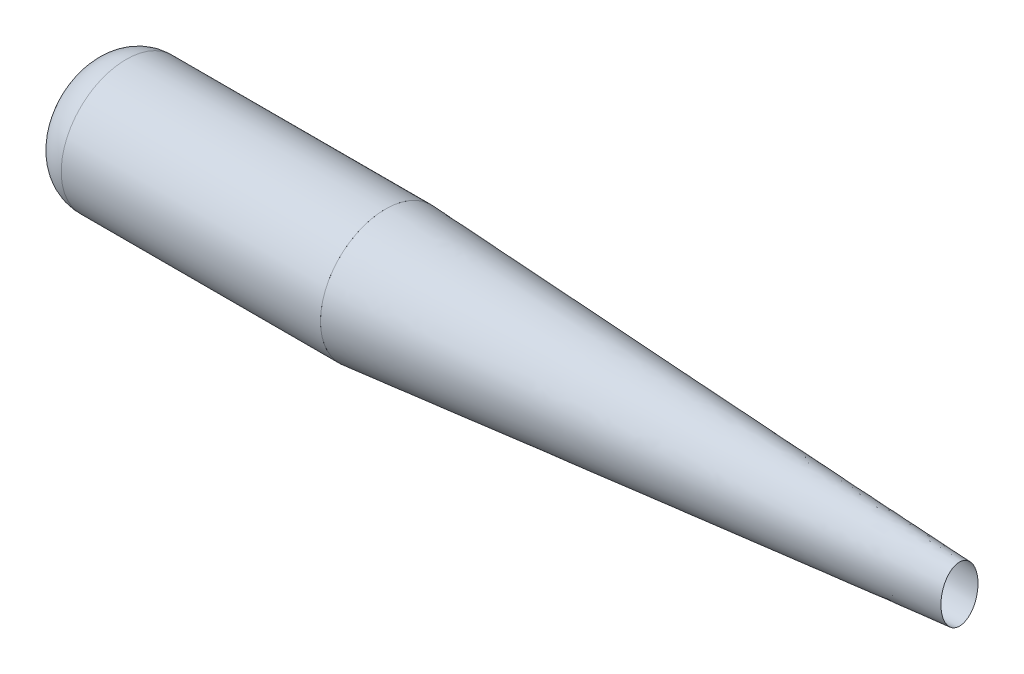
ISO-10303-21;
HEADER;
FILE_DESCRIPTION(('STEP AP214'),'2;1');
FILE_NAME('part.step','',(''),(''),'','','');
FILE_SCHEMA(('AUTOMOTIVE_DESIGN { 1 0 10303 214 1 1 1 1 }'));
ENDSEC;
DATA;
#1=APPLICATION_CONTEXT('core data for automotive mechanical design processes');
#2=APPLICATION_PROTOCOL_DEFINITION('international standard','automotive_design',2000,#1);
#3=PRODUCT_CONTEXT('',#1,'mechanical');
#4=PRODUCT('Part','Part','',(#3));
#5=PRODUCT_RELATED_PRODUCT_CATEGORY('part','',(#4));
#6=PRODUCT_DEFINITION_FORMATION('','',#4);
#7=PRODUCT_DEFINITION_CONTEXT('part definition',#1,'design');
#8=PRODUCT_DEFINITION('design','',#6,#7);
#9=PRODUCT_DEFINITION_SHAPE('','',#8);
#10=(LENGTH_UNIT() NAMED_UNIT(*) SI_UNIT(.MILLI.,.METRE.));
#11=(NAMED_UNIT(*) PLANE_ANGLE_UNIT() SI_UNIT($,.RADIAN.));
#12=(NAMED_UNIT(*) SI_UNIT($,.STERADIAN.) SOLID_ANGLE_UNIT());
#13=UNCERTAINTY_MEASURE_WITH_UNIT(LENGTH_MEASURE(1.E-05),#10,'distance_accuracy_value','');
#14=(GEOMETRIC_REPRESENTATION_CONTEXT(3) GLOBAL_UNCERTAINTY_ASSIGNED_CONTEXT((#13)) GLOBAL_UNIT_ASSIGNED_CONTEXT((#10,
#11,#12)) REPRESENTATION_CONTEXT('',''));
#15=CARTESIAN_POINT('',(0.,0.,0.));
#16=DIRECTION('',(0.,0.,1.));
#17=DIRECTION('',(1.,0.,0.));
#18=AXIS2_PLACEMENT_3D('',#15,#16,#17);
#19=CARTESIAN_POINT('',(160.,0.,-35.));
#20=CARTESIAN_POINT('',(263.333333333333,3.33333333333333,-26.6666666666667));
#21=CARTESIAN_POINT('',(366.666666666667,6.66666666666666,-18.3333333333333));
#22=CARTESIAN_POINT('',(470.,10.,-10.));
#23=CARTESIAN_POINT('',(160.,2.2907446249626,-35.));
#24=CARTESIAN_POINT('',(263.333333333333,5.13593806917554,-26.6666666666667));
#25=CARTESIAN_POINT('',(366.666666666667,7.98113151338849,-18.3333333333333));
#26=CARTESIAN_POINT('',(470.,10.8263249576014,-10.));
#27=CARTESIAN_POINT('',(160.,6.87217397037005,-34.5489011907527));
#28=CARTESIAN_POINT('',(263.333333333333,8.74111426669822,-26.3356648520266));
#29=CARTESIAN_POINT('',(366.666666666667,10.6100545630264,-18.1224285133004));
#30=CARTESIAN_POINT('',(470.,12.4789948593546,-9.90919217457428));
#31=CARTESIAN_POINT('',(160.,13.4802960863983,-32.5442620372788));
#32=CARTESIAN_POINT('',(263.333333333334,13.9626756302988,-24.8615380126565));
#33=CARTESIAN_POINT('',(366.666666666667,14.4450551741992,-17.1788139880343));
#34=CARTESIAN_POINT('',(470.,14.9274347180997,-9.49608996341209));
#35=CARTESIAN_POINT('',(160.,19.5703557965586,-29.2891017108546));
#36=CARTESIAN_POINT('',(263.333333333333,18.8167461273719,-22.4567418642144));
#37=CARTESIAN_POINT('',(366.666666666666,18.0631364581851,-15.6243820175742));
#38=CARTESIAN_POINT('',(470.,17.3095267889983,-8.79202217093392));
#39=CARTESIAN_POINT('',(160.,24.9083452853691,-24.9082788510293));
#40=CARTESIAN_POINT('',(263.333333333333,23.1309813977877,-19.1963711667751));
#41=CARTESIAN_POINT('',(366.666666666667,21.3536175102062,-13.484463482521));
#42=CARTESIAN_POINT('',(470.,19.5762536226248,-7.7725557982668));
#43=CARTESIAN_POINT('',(160.,29.2891044173845,-19.570338475145));
#44=CARTESIAN_POINT('',(263.333333333333,26.744136013561,-15.1812036963901));
#45=CARTESIAN_POINT('',(366.666666666667,24.1991676097375,-10.7920689176353));
#46=CARTESIAN_POINT('',(470.,21.654199205914,-6.40293413888038));
#47=CARTESIAN_POINT('',(160.,32.5442975900147,-13.4802693135727));
#48=CARTESIAN_POINT('',(263.333333333333,29.5035965677605,-10.5345265102586));
#49=CARTESIAN_POINT('',(366.666666666666,26.4628955455064,-7.58878370694443));
#50=CARTESIAN_POINT('',(469.999999999999,23.4221945232523,-4.64304090363027));
#51=CARTESIAN_POINT('',(160.,34.5488400594126,-6.87218748700974));
#52=CARTESIAN_POINT('',(263.333333333334,31.2603620625595,-5.4071170467015));
#53=CARTESIAN_POINT('',(366.666666666667,27.9718840657064,-3.94204660639326));
#54=CARTESIAN_POINT('',(470.,24.6834060688532,-2.47697616608501));
#55=CARTESIAN_POINT('',(160.,35.225689068238,0.));
#56=CARTESIAN_POINT('',(263.333333333333,31.8702303801478,0.));
#57=CARTESIAN_POINT('',(366.666666666666,28.5147716920577,0.));
#58=CARTESIAN_POINT('',(470.,25.1593130039676,0.));
#59=CARTESIAN_POINT('',(160.,34.5488400594126,6.8721874870098));
#60=CARTESIAN_POINT('',(263.333333333333,31.2603620625595,5.40711704670152));
#61=CARTESIAN_POINT('',(366.666666666667,27.9718840657064,3.94204660639325));
#62=CARTESIAN_POINT('',(470.,24.6834060688532,2.47697616608497));
#63=CARTESIAN_POINT('',(160.,32.5442975900147,13.4802693135728));
#64=CARTESIAN_POINT('',(263.333333333334,29.5035965677606,10.5345265102586));
#65=CARTESIAN_POINT('',(366.666666666667,26.4628955455065,7.58878370694443));
#66=CARTESIAN_POINT('',(470.,23.4221945232524,4.64304090363026));
#67=CARTESIAN_POINT('',(160.,29.2891044173845,19.570338475145));
#68=CARTESIAN_POINT('',(263.333333333333,26.744136013561,15.1812036963901));
#69=CARTESIAN_POINT('',(366.666666666666,24.1991676097375,10.7920689176352));
#70=CARTESIAN_POINT('',(469.999999999999,21.654199205914,6.40293413888035));
#71=CARTESIAN_POINT('',(160.000000000001,24.9083452853691,24.9082788510293));
#72=CARTESIAN_POINT('',(263.333333333334,23.1309813977877,19.1963711667751));
#73=CARTESIAN_POINT('',(366.666666666667,21.3536175102062,13.484463482521));
#74=CARTESIAN_POINT('',(470.,19.5762536226248,7.77255579826679));
#75=CARTESIAN_POINT('',(160.,19.5703557965587,29.2891017108547));
#76=CARTESIAN_POINT('',(263.333333333333,18.8167461273719,22.4567418642145));
#77=CARTESIAN_POINT('',(366.666666666666,18.0631364581851,15.6243820175742));
#78=CARTESIAN_POINT('',(469.999999999999,17.3095267889983,8.79202217093389));
#79=CARTESIAN_POINT('',(160.,13.4802960863983,32.5442620372787));
#80=CARTESIAN_POINT('',(263.333333333334,13.9626756302988,24.8615380126565));
#81=CARTESIAN_POINT('',(366.666666666667,14.4450551741992,17.1788139880343));
#82=CARTESIAN_POINT('',(470.,14.9274347180997,9.49608996341211));
#83=CARTESIAN_POINT('',(160.,6.8721739703701,34.5489011907528));
#84=CARTESIAN_POINT('',(263.333333333333,8.74111426669826,26.3356648520266));
#85=CARTESIAN_POINT('',(366.666666666667,10.6100545630264,18.1224285133004));
#86=CARTESIAN_POINT('',(470.,12.4789948593546,9.90919217457426));
#87=CARTESIAN_POINT('',(160.,2.29074462496261,35.));
#88=CARTESIAN_POINT('',(263.333333333333,5.13593806917555,26.6666666666667));
#89=CARTESIAN_POINT('',(366.666666666667,7.98113151338849,18.3333333333333));
#90=CARTESIAN_POINT('',(470.,10.8263249576014,10.));
#91=CARTESIAN_POINT('',(160.,-2.2907446249626,35.));
#92=CARTESIAN_POINT('',(263.333333333333,1.53072859749112,26.6666666666667));
#93=CARTESIAN_POINT('',(366.666666666667,5.35220181994485,18.3333333333333));
#94=CARTESIAN_POINT('',(470.,9.17367504239857,10.));
#95=CARTESIAN_POINT('',(160.,-6.87217397037008,34.5489011907528));
#96=CARTESIAN_POINT('',(263.333333333333,-2.07444760003157,26.3356648520266));
#97=CARTESIAN_POINT('',(366.666666666666,2.72327877030694,18.1224285133004));
#98=CARTESIAN_POINT('',(470.,7.52100514064545,9.90919217457427));
#99=CARTESIAN_POINT('',(160.,-13.4802960863983,32.5442620372787));
#100=CARTESIAN_POINT('',(263.333333333334,-7.29600896363213,24.8615380126565));
#101=CARTESIAN_POINT('',(366.666666666667,-1.11172184086592,17.1788139880343));
#102=CARTESIAN_POINT('',(470.,5.07256528190029,9.49608996341211));
#103=CARTESIAN_POINT('',(160.,-19.5703557965587,29.2891017108548));
#104=CARTESIAN_POINT('',(263.333333333333,-12.1500794607052,22.4567418642145));
#105=CARTESIAN_POINT('',(366.666666666666,-4.72980312485177,15.6243820175742));
#106=CARTESIAN_POINT('',(470.,2.69047321100169,8.79202217093387));
#107=CARTESIAN_POINT('',(160.,-24.9083452853691,24.9082788510292));
#108=CARTESIAN_POINT('',(263.333333333333,-16.464314731121,19.1963711667751));
#109=CARTESIAN_POINT('',(366.666666666666,-8.02028417687292,13.4844634825209));
#110=CARTESIAN_POINT('',(469.999999999999,0.423746377375175,7.77255579826682));
#111=CARTESIAN_POINT('',(160.,-29.2891044173845,19.570338475145));
#112=CARTESIAN_POINT('',(263.333333333334,-20.0774693468943,15.1812036963901));
#113=CARTESIAN_POINT('',(366.666666666667,-10.8658342764042,10.7920689176353));
#114=CARTESIAN_POINT('',(470.,-1.65419920591402,6.40293413888035));
#115=CARTESIAN_POINT('',(160.,-32.5442975900147,13.4802693135726));
#116=CARTESIAN_POINT('',(263.333333333333,-22.8369299010939,10.5345265102585));
#117=CARTESIAN_POINT('',(366.666666666667,-13.1295622121731,7.58878370694439));
#118=CARTESIAN_POINT('',(470.,-3.42219452325231,4.64304090363027));
#119=CARTESIAN_POINT('',(160.,-34.5488400594126,6.87218748700977));
#120=CARTESIAN_POINT('',(263.333333333333,-24.5936953958928,5.40711704670151));
#121=CARTESIAN_POINT('',(366.666666666666,-14.6385507323731,3.94204660639324));
#122=CARTESIAN_POINT('',(469.999999999999,-4.6834060688533,2.47697616608498));
#123=CARTESIAN_POINT('',(160.,-35.2256890682379,0.));
#124=CARTESIAN_POINT('',(263.333333333334,-25.2035637134811,0.));
#125=CARTESIAN_POINT('',(366.666666666667,-15.1814383587244,0.));
#126=CARTESIAN_POINT('',(470.,-5.15931300396757,0.));
#127=CARTESIAN_POINT('',(160.,-34.5488400594126,-6.8721874870098));
#128=CARTESIAN_POINT('',(263.333333333333,-24.5936953958929,-5.40711704670154));
#129=CARTESIAN_POINT('',(366.666666666667,-14.6385507323731,-3.94204660639327));
#130=CARTESIAN_POINT('',(470.,-4.68340606885328,-2.47697616608501));
#131=CARTESIAN_POINT('',(160.,-32.5442975900147,-13.4802693135727));
#132=CARTESIAN_POINT('',(263.333333333333,-22.8369299010939,-10.5345265102586));
#133=CARTESIAN_POINT('',(366.666666666667,-13.1295622121731,-7.58878370694444));
#134=CARTESIAN_POINT('',(470.,-3.42219452325229,-4.6430409036303));
#135=CARTESIAN_POINT('',(160.,-29.2891044173845,-19.570338475145));
#136=CARTESIAN_POINT('',(263.333333333333,-20.0774693468943,-15.1812036963901));
#137=CARTESIAN_POINT('',(366.666666666667,-10.8658342764041,-10.7920689176353));
#138=CARTESIAN_POINT('',(470.,-1.65419920591399,-6.40293413888037));
#139=CARTESIAN_POINT('',(160.,-24.9083452853691,-24.9082788510293));
#140=CARTESIAN_POINT('',(263.333333333334,-16.464314731121,-19.1963711667751));
#141=CARTESIAN_POINT('',(366.666666666667,-8.02028417687289,-13.484463482521));
#142=CARTESIAN_POINT('',(470.,0.423746377375195,-7.77255579826683));
#143=CARTESIAN_POINT('',(160.,-19.5703557965587,-29.2891017108547));
#144=CARTESIAN_POINT('',(263.333333333333,-12.1500794607052,-22.4567418642145));
#145=CARTESIAN_POINT('',(366.666666666666,-4.72980312485176,-15.6243820175742));
#146=CARTESIAN_POINT('',(470.,2.6904732110017,-8.79202217093389));
#147=CARTESIAN_POINT('',(160.,-13.4802960863983,-32.5442620372787));
#148=CARTESIAN_POINT('',(263.333333333333,-7.29600896363209,-24.8615380126565));
#149=CARTESIAN_POINT('',(366.666666666667,-1.11172184086589,-17.1788139880343));
#150=CARTESIAN_POINT('',(470.,5.0725652819003,-9.49608996341211));
#151=CARTESIAN_POINT('',(160.,-6.87217397037005,-34.5489011907528));
#152=CARTESIAN_POINT('',(263.333333333333,-2.07444760003155,-26.3356648520266));
#153=CARTESIAN_POINT('',(366.666666666667,2.72327877030695,-18.1224285133004));
#154=CARTESIAN_POINT('',(470.,7.52100514064546,-9.90919217457426));
#155=CARTESIAN_POINT('',(160.,-2.2907446249626,-35.));
#156=CARTESIAN_POINT('',(263.333333333333,1.53072859749112,-26.6666666666667));
#157=CARTESIAN_POINT('',(366.666666666667,5.35220181994484,-18.3333333333333));
#158=CARTESIAN_POINT('',(470.,9.17367504239856,-10.));
#159=CARTESIAN_POINT('',(160.,0.,-35.));
#160=CARTESIAN_POINT('',(263.333333333333,3.33333333333333,-26.6666666666667));
#161=CARTESIAN_POINT('',(366.666666666667,6.66666666666666,-18.3333333333333));
#162=CARTESIAN_POINT('',(470.,10.,-10.));
#163=B_SPLINE_SURFACE_WITH_KNOTS('',3,3,((#19,#20,#21,#22),(#23,#24,#25,#26),(#27,#28,#29,#30),
(#31,#32,#33,#34),(#35,#36,#37,#38),(#39,#40,#41,#42),(#43,#44,#45,#46),(#47,#48,#49,#50),(#51,
#52,#53,#54),(#55,#56,#57,#58),(#59,#60,#61,#62),(#63,#64,#65,#66),(#67,#68,#69,#70),(#71,#72,
#73,#74),(#75,#76,#77,#78),(#79,#80,#81,#82),(#83,#84,#85,#86),(#87,#88,#89,#90),(#91,#92,#93,
#94),(#95,#96,#97,#98),(#99,#100,#101,#102),(#103,#104,#105,#106),(#107,#108,#109,#110),(#111,
#112,#113,#114),(#115,#116,#117,#118),(#119,#120,#121,#122),(#123,#124,#125,#126),(#127,#128,
#129,#130),(#131,#132,#133,#134),(#135,#136,#137,#138),(#139,#140,#141,#142),(#143,#144,#145,
#146),(#147,#148,#149,#150),(#151,#152,#153,#154),(#155,#156,#157,#158),(#159,#160,#161,#162)),
.UNSPECIFIED.,.T.,.F.,.F.,(4,1,1,1,1,1,1,1,1,1,1,1,1,1,1,1,2,1,1,1,1,1,1,1,1,1,1,1,1,1,1,1,4),
(4,4),(0.,0.03125,0.0625,0.09375,0.125,0.15625,0.1875,0.21875,0.25,0.28125,0.3125,0.34375,0.375,
0.40625,0.4375,0.46875,0.5,0.53125,0.5625,0.59375,0.625,0.65625,0.6875,0.71875,0.75,0.78125,
0.8125,0.84375,0.875,0.90625,0.9375,0.96875,1.),(0.,1.),.UNSPECIFIED.);
#164=CARTESIAN_POINT('',(160.,0.,-35.));
#165=CARTESIAN_POINT('',(160.,2.2907446249626,-35.));
#166=CARTESIAN_POINT('',(160.,6.87217397037005,-34.5489011907527));
#167=CARTESIAN_POINT('',(160.,13.4802960863983,-32.5442620372788));
#168=CARTESIAN_POINT('',(160.,19.5703557965586,-29.2891017108546));
#169=CARTESIAN_POINT('',(160.,24.9083452853691,-24.9082788510293));
#170=CARTESIAN_POINT('',(160.,29.2891044173845,-19.570338475145));
#171=CARTESIAN_POINT('',(160.,32.5442975900147,-13.4802693135727));
#172=CARTESIAN_POINT('',(160.,34.5488400594126,-6.87218748700974));
#173=CARTESIAN_POINT('',(160.,35.225689068238,0.));
#174=CARTESIAN_POINT('',(160.,34.5488400594126,6.8721874870098));
#175=CARTESIAN_POINT('',(160.,32.5442975900147,13.4802693135728));
#176=CARTESIAN_POINT('',(160.,29.2891044173845,19.570338475145));
#177=CARTESIAN_POINT('',(160.000000000001,24.9083452853691,24.9082788510293));
#178=CARTESIAN_POINT('',(160.,19.5703557965587,29.2891017108547));
#179=CARTESIAN_POINT('',(160.,13.4802960863983,32.5442620372787));
#180=CARTESIAN_POINT('',(160.,6.8721739703701,34.5489011907528));
#181=CARTESIAN_POINT('',(160.,2.29074462496261,35.));
#182=CARTESIAN_POINT('',(160.,-2.2907446249626,35.));
#183=CARTESIAN_POINT('',(160.,-6.87217397037008,34.5489011907528));
#184=CARTESIAN_POINT('',(160.,-13.4802960863983,32.5442620372787));
#185=CARTESIAN_POINT('',(160.,-19.5703557965587,29.2891017108548));
#186=CARTESIAN_POINT('',(160.,-24.9083452853691,24.9082788510292));
#187=CARTESIAN_POINT('',(160.,-29.2891044173845,19.570338475145));
#188=CARTESIAN_POINT('',(160.,-32.5442975900147,13.4802693135726));
#189=CARTESIAN_POINT('',(160.,-34.5488400594126,6.87218748700977));
#190=CARTESIAN_POINT('',(160.,-35.2256890682379,0.));
#191=CARTESIAN_POINT('',(160.,-34.5488400594126,-6.8721874870098));
#192=CARTESIAN_POINT('',(160.,-32.5442975900147,-13.4802693135727));
#193=CARTESIAN_POINT('',(160.,-29.2891044173845,-19.570338475145));
#194=CARTESIAN_POINT('',(160.,-24.9083452853691,-24.9082788510293));
#195=CARTESIAN_POINT('',(160.,-19.5703557965587,-29.2891017108547));
#196=CARTESIAN_POINT('',(160.,-13.4802960863983,-32.5442620372787));
#197=CARTESIAN_POINT('',(160.,-6.87217397037005,-34.5489011907528));
#198=CARTESIAN_POINT('',(160.,-2.2907446249626,-35.));
#199=CARTESIAN_POINT('',(160.,0.,-35.));
#200=B_SPLINE_CURVE_WITH_KNOTS('',3,(#164,#165,#166,#167,#168,#169,#170,#171,#172,#173,#174,
#175,#176,#177,#178,#179,#180,#181,#182,#183,#184,#185,#186,#187,#188,#189,#190,#191,#192,#193,
#194,#195,#196,#197,#198,#199),.UNSPECIFIED.,.T.,.F.,(4,1,1,1,1,1,1,1,1,1,1,1,1,1,1,1,2,1,1,1,1,
1,1,1,1,1,1,1,1,1,1,1,4),(0.,0.03125,0.0625,0.09375,0.125,0.15625,0.1875,0.21875,0.25,0.28125,
0.3125,0.34375,0.375,0.40625,0.4375,0.46875,0.5,0.53125,0.5625,0.59375,0.625,0.65625,0.6875,
0.71875,0.75,0.78125,0.8125,0.84375,0.875,0.90625,0.9375,0.96875,1.),.UNSPECIFIED.);
#201=CARTESIAN_POINT('',(160.,0.,-35.));
#202=VERTEX_POINT('',#201);
#203=EDGE_CURVE('E13',#202,#202,#200,.T.);
#204=CARTESIAN_POINT('',(470.,10.,-10.));
#205=CARTESIAN_POINT('',(470.,10.8263249576014,-10.));
#206=CARTESIAN_POINT('',(470.,12.4789948593546,-9.90919217457428));
#207=CARTESIAN_POINT('',(470.,14.9274347180997,-9.49608996341209));
#208=CARTESIAN_POINT('',(470.,17.3095267889983,-8.79202217093392));
#209=CARTESIAN_POINT('',(470.,19.5762536226248,-7.7725557982668));
#210=CARTESIAN_POINT('',(470.,21.654199205914,-6.40293413888038));
#211=CARTESIAN_POINT('',(469.999999999999,23.4221945232523,-4.64304090363027));
#212=CARTESIAN_POINT('',(470.,24.6834060688532,-2.47697616608501));
#213=CARTESIAN_POINT('',(470.,25.1593130039676,0.));
#214=CARTESIAN_POINT('',(470.,24.6834060688532,2.47697616608497));
#215=CARTESIAN_POINT('',(470.,23.4221945232524,4.64304090363026));
#216=CARTESIAN_POINT('',(469.999999999999,21.654199205914,6.40293413888035));
#217=CARTESIAN_POINT('',(470.,19.5762536226248,7.77255579826679));
#218=CARTESIAN_POINT('',(469.999999999999,17.3095267889983,8.79202217093389));
#219=CARTESIAN_POINT('',(470.,14.9274347180997,9.49608996341211));
#220=CARTESIAN_POINT('',(470.,12.4789948593546,9.90919217457426));
#221=CARTESIAN_POINT('',(470.,10.8263249576014,10.));
#222=CARTESIAN_POINT('',(470.,9.17367504239857,10.));
#223=CARTESIAN_POINT('',(470.,7.52100514064545,9.90919217457427));
#224=CARTESIAN_POINT('',(470.,5.07256528190029,9.49608996341211));
#225=CARTESIAN_POINT('',(470.,2.69047321100169,8.79202217093387));
#226=CARTESIAN_POINT('',(469.999999999999,0.423746377375175,7.77255579826682));
#227=CARTESIAN_POINT('',(470.,-1.65419920591402,6.40293413888035));
#228=CARTESIAN_POINT('',(470.,-3.42219452325231,4.64304090363027));
#229=CARTESIAN_POINT('',(469.999999999999,-4.6834060688533,2.47697616608498));
#230=CARTESIAN_POINT('',(470.,-5.15931300396757,0.));
#231=CARTESIAN_POINT('',(470.,-4.68340606885328,-2.47697616608501));
#232=CARTESIAN_POINT('',(470.,-3.42219452325229,-4.6430409036303));
#233=CARTESIAN_POINT('',(470.,-1.65419920591399,-6.40293413888037));
#234=CARTESIAN_POINT('',(470.,0.423746377375195,-7.77255579826683));
#235=CARTESIAN_POINT('',(470.,2.6904732110017,-8.79202217093389));
#236=CARTESIAN_POINT('',(470.,5.0725652819003,-9.49608996341211));
#237=CARTESIAN_POINT('',(470.,7.52100514064546,-9.90919217457426));
#238=CARTESIAN_POINT('',(470.,9.17367504239856,-10.));
#239=CARTESIAN_POINT('',(470.,10.,-10.));
#240=B_SPLINE_CURVE_WITH_KNOTS('',3,(#204,#205,#206,#207,#208,#209,#210,#211,#212,#213,#214,
#215,#216,#217,#218,#219,#220,#221,#222,#223,#224,#225,#226,#227,#228,#229,#230,#231,#232,#233,
#234,#235,#236,#237,#238,#239),.UNSPECIFIED.,.T.,.F.,(4,1,1,1,1,1,1,1,1,1,1,1,1,1,1,1,2,1,1,1,1,
1,1,1,1,1,1,1,1,1,1,1,4),(0.,0.03125,0.0625,0.09375,0.125,0.15625,0.1875,0.21875,0.25,0.28125,
0.3125,0.34375,0.375,0.40625,0.4375,0.46875,0.5,0.53125,0.5625,0.59375,0.625,0.65625,0.6875,
0.71875,0.75,0.78125,0.8125,0.84375,0.875,0.90625,0.9375,0.96875,1.),.UNSPECIFIED.);
#241=CARTESIAN_POINT('',(470.,10.,-10.));
#242=VERTEX_POINT('',#241);
#243=EDGE_CURVE('E94',#242,#242,#240,.F.);
#244=ORIENTED_EDGE('',*,*,#203,.T.);
#245=EDGE_LOOP('',(#244));
#246=FACE_BOUND('',#245,.T.);
#247=ORIENTED_EDGE('',*,*,#243,.T.);
#248=EDGE_LOOP('',(#247));
#249=FACE_BOUND('',#248,.T.);
#250=ADVANCED_FACE('F91',(#246,#249),#163,.T.);
#251=OPEN_SHELL('',(#250));
#252=SHELL_BASED_SURFACE_MODEL('B2',(#251));
#253=CARTESIAN_POINT('',(0.,0.,-15.));
#254=DIRECTION('',(-1.,0.,0.));
#255=DIRECTION('',(0.,0.,1.));
#256=AXIS2_PLACEMENT_3D('',#253,#254,#255);
#257=PLANE('',#256);
#258=CARTESIAN_POINT('',(0.,0.,0.));
#259=DIRECTION('',(1.,0.,0.));
#260=DIRECTION('',(0.,0.,-1.));
#261=AXIS2_PLACEMENT_3D('',#258,#259,#260);
#262=CIRCLE('',#261,15.);
#263=CARTESIAN_POINT('',(0.,0.,-15.));
#264=VERTEX_POINT('',#263);
#265=EDGE_CURVE('E90',#264,#264,#262,.T.);
#266=ORIENTED_EDGE('',*,*,#265,.F.);
#267=EDGE_LOOP('',(#266));
#268=FACE_BOUND('',#267,.T.);
#269=ADVANCED_FACE('F133',(#268),#257,.T.);
#270=CARTESIAN_POINT('',(20.,0.,0.));
#271=DIRECTION('',(1.,0.,0.));
#272=DIRECTION('',(0.,0.,-1.));
#273=AXIS2_PLACEMENT_3D('',#270,#271,#272);
#274=DEGENERATE_TOROIDAL_SURFACE('',#273,15.,20.,.T.);
#275=ORIENTED_EDGE('',*,*,#265,.T.);
#276=EDGE_LOOP('',(#275));
#277=FACE_BOUND('',#276,.T.);
#278=CARTESIAN_POINT('',(20.,0.,0.));
#279=DIRECTION('',(1.,0.,0.));
#280=DIRECTION('',(0.,0.,-1.));
#281=AXIS2_PLACEMENT_3D('',#278,#279,#280);
#282=CIRCLE('',#281,35.);
#283=CARTESIAN_POINT('',(20.,0.,-35.));
#284=VERTEX_POINT('',#283);
#285=EDGE_CURVE('E141',#284,#284,#282,.T.);
#286=ORIENTED_EDGE('',*,*,#285,.F.);
#287=EDGE_LOOP('',(#286));
#288=FACE_BOUND('',#287,.T.);
#289=ADVANCED_FACE('F163',(#277,#288),#274,.T.);
#290=CARTESIAN_POINT('',(160.,0.,0.));
#291=DIRECTION('',(1.,0.,0.));
#292=DIRECTION('',(0.,0.,-1.));
#293=AXIS2_PLACEMENT_3D('',#290,#291,#292);
#294=PLANE('',#293);
#295=CARTESIAN_POINT('',(160.,0.,0.));
#296=DIRECTION('',(1.,0.,0.));
#297=DIRECTION('',(0.,0.,-1.));
#298=AXIS2_PLACEMENT_3D('',#295,#296,#297);
#299=CIRCLE('',#298,35.);
#300=CARTESIAN_POINT('',(160.,0.,-35.));
#301=VERTEX_POINT('',#300);
#302=EDGE_CURVE('E147',#301,#301,#299,.T.);
#303=ORIENTED_EDGE('',*,*,#302,.T.);
#304=EDGE_LOOP('',(#303));
#305=FACE_BOUND('',#304,.T.);
#306=CARTESIAN_POINT('',(160.,0.,0.));
#307=DIRECTION('',(1.,0.,0.));
#308=DIRECTION('',(0.,0.,-1.));
#309=AXIS2_PLACEMENT_3D('',#306,#307,#308);
#310=CIRCLE('',#309,33.);
#311=CARTESIAN_POINT('',(160.,0.,-33.));
#312=VERTEX_POINT('',#311);
#313=EDGE_CURVE('E150',#312,#312,#310,.T.);
#314=ORIENTED_EDGE('',*,*,#313,.F.);
#315=EDGE_LOOP('',(#314));
#316=FACE_BOUND('',#315,.T.);
#317=ADVANCED_FACE('F160',(#305,#316),#294,.T.);
#318=CARTESIAN_POINT('',(160.,0.,0.));
#319=DIRECTION('',(-1.,0.,0.));
#320=DIRECTION('',(0.,0.,1.));
#321=AXIS2_PLACEMENT_3D('',#318,#319,#320);
#322=CYLINDRICAL_SURFACE('',#321,35.);
#323=ORIENTED_EDGE('',*,*,#302,.F.);
#324=EDGE_LOOP('',(#323));
#325=FACE_BOUND('',#324,.T.);
#326=ORIENTED_EDGE('',*,*,#285,.T.);
#327=EDGE_LOOP('',(#326));
#328=FACE_BOUND('',#327,.T.);
#329=ADVANCED_FACE('F162',(#325,#328),#322,.T.);
#330=CARTESIAN_POINT('',(160.,0.,0.));
#331=DIRECTION('',(-1.,0.,0.));
#332=DIRECTION('',(0.,0.,1.));
#333=AXIS2_PLACEMENT_3D('',#330,#331,#332);
#334=CYLINDRICAL_SURFACE('',#333,33.);
#335=ORIENTED_EDGE('',*,*,#313,.T.);
#336=EDGE_LOOP('',(#335));
#337=FACE_BOUND('',#336,.T.);
#338=CARTESIAN_POINT('',(20.,0.,0.));
#339=DIRECTION('',(1.,0.,0.));
#340=DIRECTION('',(0.,0.,-1.));
#341=AXIS2_PLACEMENT_3D('',#338,#339,#340);
#342=CIRCLE('',#341,33.);
#343=CARTESIAN_POINT('',(20.,0.,-33.));
#344=VERTEX_POINT('',#343);
#345=EDGE_CURVE('E151',#344,#344,#342,.T.);
#346=ORIENTED_EDGE('',*,*,#345,.F.);
#347=EDGE_LOOP('',(#346));
#348=FACE_BOUND('',#347,.T.);
#349=ADVANCED_FACE('F157',(#337,#348),#334,.F.);
#350=CARTESIAN_POINT('',(2.,0.,-15.));
#351=DIRECTION('',(-1.,0.,0.));
#352=DIRECTION('',(0.,0.,1.));
#353=AXIS2_PLACEMENT_3D('',#350,#351,#352);
#354=PLANE('',#353);
#355=CARTESIAN_POINT('',(2.,0.,0.));
#356=DIRECTION('',(1.,0.,0.));
#357=DIRECTION('',(0.,0.,-1.));
#358=AXIS2_PLACEMENT_3D('',#355,#356,#357);
#359=CIRCLE('',#358,15.);
#360=CARTESIAN_POINT('',(2.,0.,-15.));
#361=VERTEX_POINT('',#360);
#362=EDGE_CURVE('E137',#361,#361,#359,.T.);
#363=ORIENTED_EDGE('',*,*,#362,.T.);
#364=EDGE_LOOP('',(#363));
#365=FACE_BOUND('',#364,.T.);
#366=ADVANCED_FACE('F179',(#365),#354,.F.);
#367=CARTESIAN_POINT('',(20.,0.,0.));
#368=DIRECTION('',(1.,0.,0.));
#369=DIRECTION('',(0.,0.,-1.));
#370=AXIS2_PLACEMENT_3D('',#367,#368,#369);
#371=DEGENERATE_TOROIDAL_SURFACE('',#370,15.,18.,.T.);
#372=ORIENTED_EDGE('',*,*,#362,.F.);
#373=EDGE_LOOP('',(#372));
#374=FACE_BOUND('',#373,.T.);
#375=ORIENTED_EDGE('',*,*,#345,.T.);
#376=EDGE_LOOP('',(#375));
#377=FACE_BOUND('',#376,.T.);
#378=ADVANCED_FACE('F135',(#374,#377),#371,.F.);
#379=CLOSED_SHELL('',(#269,#289,#317,#329,#349,#366,#378));
#380=MANIFOLD_SOLID_BREP('B8',#379);
#381=ADVANCED_BREP_SHAPE_REPRESENTATION('',(#18,#380),#14);
#382=MANIFOLD_SURFACE_SHAPE_REPRESENTATION('',(#18,#252),#14);
#383=SHAPE_REPRESENTATION('',(#18),#14);
#384=SHAPE_DEFINITION_REPRESENTATION(#9,#383);
#385=SHAPE_REPRESENTATION_RELATIONSHIP('','',#383,#381);
#386=SHAPE_REPRESENTATION_RELATIONSHIP('','',#383,#382);
ENDSEC;
END-ISO-10303-21;
